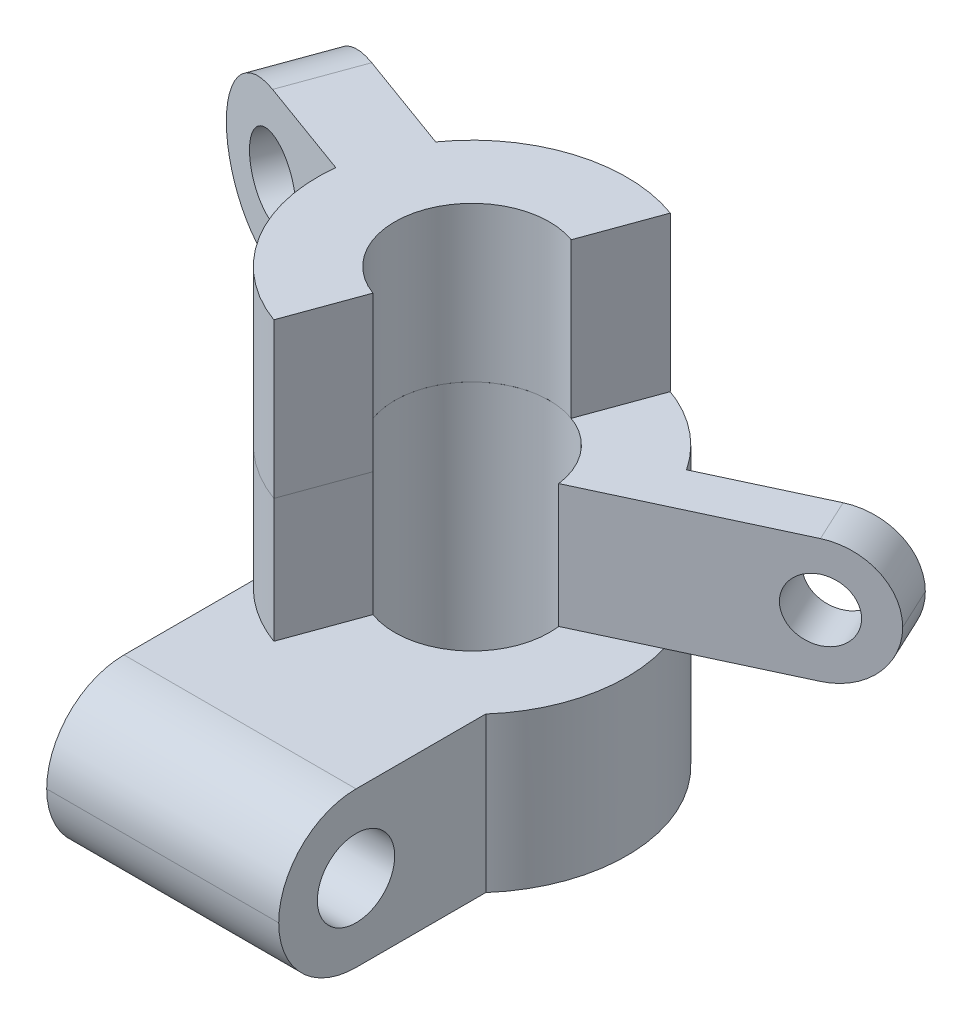
ISO-10303-21;
HEADER;
FILE_DESCRIPTION(('STEP AP214'),'2;1');
FILE_NAME('part.step','',(''),(''),'','','');
FILE_SCHEMA(('AUTOMOTIVE_DESIGN { 1 0 10303 214 1 1 1 1 }'));
ENDSEC;
DATA;
#1=APPLICATION_CONTEXT('core data for automotive mechanical design processes');
#2=APPLICATION_PROTOCOL_DEFINITION('international standard','automotive_design',2000,#1);
#3=PRODUCT_CONTEXT('',#1,'mechanical');
#4=PRODUCT('Part','Part','',(#3));
#5=PRODUCT_RELATED_PRODUCT_CATEGORY('part','',(#4));
#6=PRODUCT_DEFINITION_FORMATION('','',#4);
#7=PRODUCT_DEFINITION_CONTEXT('part definition',#1,'design');
#8=PRODUCT_DEFINITION('design','',#6,#7);
#9=PRODUCT_DEFINITION_SHAPE('','',#8);
#10=(LENGTH_UNIT() NAMED_UNIT(*) SI_UNIT(.MILLI.,.METRE.));
#11=(NAMED_UNIT(*) PLANE_ANGLE_UNIT() SI_UNIT($,.RADIAN.));
#12=(NAMED_UNIT(*) SI_UNIT($,.STERADIAN.) SOLID_ANGLE_UNIT());
#13=UNCERTAINTY_MEASURE_WITH_UNIT(LENGTH_MEASURE(1.E-05),#10,'distance_accuracy_value','');
#14=(GEOMETRIC_REPRESENTATION_CONTEXT(3) GLOBAL_UNCERTAINTY_ASSIGNED_CONTEXT((#13)) GLOBAL_UNIT_ASSIGNED_CONTEXT((#10,
#11,#12)) REPRESENTATION_CONTEXT('',''));
#15=CARTESIAN_POINT('',(0.,0.,0.));
#16=DIRECTION('',(0.,0.,1.));
#17=DIRECTION('',(1.,0.,0.));
#18=AXIS2_PLACEMENT_3D('',#15,#16,#17);
#19=CARTESIAN_POINT('',(15.,56.,-40.));
#20=DIRECTION('',(0.,-1.,0.));
#21=DIRECTION('',(0.,0.,-1.));
#22=AXIS2_PLACEMENT_3D('',#19,#20,#21);
#23=CYLINDRICAL_SURFACE('',#22,10.);
#24=CARTESIAN_POINT('',(15.,36.,-40.));
#25=DIRECTION('',(0.,1.,0.));
#26=DIRECTION('',(0.,0.,1.));
#27=AXIS2_PLACEMENT_3D('',#24,#25,#26);
#28=CIRCLE('',#27,10.);
#29=CARTESIAN_POINT('',(11.5797985667433,36.,-30.6030737921409));
#30=VERTEX_POINT('',#29);
#31=CARTESIAN_POINT('',(18.4202014332567,36.,-49.3969262078591));
#32=VERTEX_POINT('',#31);
#33=EDGE_CURVE('E149',#30,#32,#28,.F.);
#34=ORIENTED_EDGE('',*,*,#33,.T.);
#35=DIRECTION('',(0.,-1.,0.));
#36=VECTOR('',#35,1.);
#37=CARTESIAN_POINT('',(18.4202014332567,56.,-49.3969262078591));
#38=LINE('',#37,#36);
#39=CARTESIAN_POINT('',(18.4202014332567,56.,-49.3969262078591));
#40=VERTEX_POINT('',#39);
#41=EDGE_CURVE('E130',#40,#32,#38,.T.);
#42=ORIENTED_EDGE('',*,*,#41,.F.);
#43=CARTESIAN_POINT('',(15.,56.,-40.));
#44=DIRECTION('',(0.,1.,0.));
#45=DIRECTION('',(0.,0.,1.));
#46=AXIS2_PLACEMENT_3D('',#43,#44,#45);
#47=CIRCLE('',#46,10.);
#48=CARTESIAN_POINT('',(11.5797985667433,56.,-30.6030737921409));
#49=VERTEX_POINT('',#48);
#50=EDGE_CURVE('E137',#49,#40,#47,.F.);
#51=ORIENTED_EDGE('',*,*,#50,.F.);
#52=DIRECTION('',(0.,-1.,0.));
#53=VECTOR('',#52,1.);
#54=CARTESIAN_POINT('',(11.5797985667433,56.,-30.6030737921409));
#55=LINE('',#54,#53);
#56=EDGE_CURVE('E204',#49,#30,#55,.T.);
#57=ORIENTED_EDGE('',*,*,#56,.T.);
#58=EDGE_LOOP('',(#34,#42,#51,#57));
#59=FACE_BOUND('',#58,.T.);
#60=ADVANCED_FACE('F55',(#59),#23,.F.);
#61=CARTESIAN_POINT('',(0.389581129661505,56.,0.14179593502859));
#62=DIRECTION('',(-0.939692620785908,0.,-0.34202014332567));
#63=DIRECTION('',(-0.34202014332567,0.,0.939692620785908));
#64=AXIS2_PLACEMENT_3D('',#61,#62,#63);
#65=PLANE('',#64);
#66=DIRECTION('',(0.34202014332567,0.,-0.939692620785908));
#67=VECTOR('',#66,1.);
#68=CARTESIAN_POINT('',(0.389581129661505,36.,0.14179593502859));
#69=LINE('',#68,#67);
#70=CARTESIAN_POINT('',(21.8404028665134,36.,-58.7938524157182));
#71=VERTEX_POINT('',#70);
#72=EDGE_CURVE('E187',#32,#71,#69,.T.);
#73=ORIENTED_EDGE('',*,*,#72,.T.);
#74=DIRECTION('',(0.,-1.,0.));
#75=VECTOR('',#74,1.);
#76=CARTESIAN_POINT('',(21.8404028665134,56.,-58.7938524157182));
#77=LINE('',#76,#75);
#78=CARTESIAN_POINT('',(21.8404028665134,56.,-58.7938524157182));
#79=VERTEX_POINT('',#78);
#80=EDGE_CURVE('E133',#79,#71,#77,.T.);
#81=ORIENTED_EDGE('',*,*,#80,.F.);
#82=DIRECTION('',(0.34202014332567,0.,-0.939692620785908));
#83=VECTOR('',#82,1.);
#84=CARTESIAN_POINT('',(0.389581129661505,56.,0.14179593502859));
#85=LINE('',#84,#83);
#86=EDGE_CURVE('E126',#40,#79,#85,.T.);
#87=ORIENTED_EDGE('',*,*,#86,.F.);
#88=ORIENTED_EDGE('',*,*,#41,.T.);
#89=EDGE_LOOP('',(#73,#81,#87,#88));
#90=FACE_BOUND('',#89,.T.);
#91=ADVANCED_FACE('F128',(#90),#65,.F.);
#92=CARTESIAN_POINT('',(15.,56.,-40.));
#93=DIRECTION('',(0.,-1.,0.));
#94=DIRECTION('',(0.,0.,-1.));
#95=AXIS2_PLACEMENT_3D('',#92,#93,#94);
#96=CYLINDRICAL_SURFACE('',#95,20.);
#97=CARTESIAN_POINT('',(15.,36.,-40.));
#98=DIRECTION('',(0.,1.,0.));
#99=DIRECTION('',(0.,0.,1.));
#100=AXIS2_PLACEMENT_3D('',#97,#98,#99);
#101=CIRCLE('',#100,20.);
#102=CARTESIAN_POINT('',(-1.297071504847,36.,-51.5933368952129));
#103=VERTEX_POINT('',#102);
#104=EDGE_CURVE('E207',#71,#103,#101,.T.);
#105=ORIENTED_EDGE('',*,*,#104,.T.);
#106=DIRECTION('',(0.,-1.,0.));
#107=VECTOR('',#106,1.);
#108=CARTESIAN_POINT('',(-1.297071504847,56.,-51.5933368952129));
#109=LINE('',#108,#107);
#110=CARTESIAN_POINT('',(-1.297071504847,56.,-51.5933368952129));
#111=VERTEX_POINT('',#110);
#112=EDGE_CURVE('E155',#111,#103,#109,.T.);
#113=ORIENTED_EDGE('',*,*,#112,.F.);
#114=CARTESIAN_POINT('',(15.,56.,-40.));
#115=DIRECTION('',(0.,1.,0.));
#116=DIRECTION('',(0.,0.,1.));
#117=AXIS2_PLACEMENT_3D('',#114,#115,#116);
#118=CIRCLE('',#117,20.);
#119=EDGE_CURVE('E136',#79,#111,#118,.T.);
#120=ORIENTED_EDGE('',*,*,#119,.F.);
#121=ORIENTED_EDGE('',*,*,#80,.T.);
#122=EDGE_LOOP('',(#105,#113,#120,#121));
#123=FACE_BOUND('',#122,.T.);
#124=ADVANCED_FACE('F221',(#123),#96,.T.);
#125=CARTESIAN_POINT('',(16.4300503061976,56.,-45.1411922167814));
#126=DIRECTION('',(0.342020143325669,0.,-0.939692620785908));
#127=DIRECTION('',(-0.939692620785908,0.,-0.342020143325669));
#128=AXIS2_PLACEMENT_3D('',#125,#126,#127);
#129=PLANE('',#128);
#130=CARTESIAN_POINT('',(-14.2997557693066,46.,-56.3259269330377));
#131=DIRECTION('',(0.342020143325669,0.,-0.939692620785908));
#132=DIRECTION('',(-0.939692620785908,0.,-0.342020143325669));
#133=AXIS2_PLACEMENT_3D('',#130,#131,#132);
#134=CIRCLE('',#133,5.);
#135=CARTESIAN_POINT('',(-18.9982188732362,46.,-58.0360276496661));
#136=VERTEX_POINT('',#135);
#137=EDGE_CURVE('E186',#136,#136,#134,.T.);
#138=ORIENTED_EDGE('',*,*,#137,.F.);
#139=EDGE_LOOP('',(#138));
#140=FACE_BOUND('',#139,.T.);
#141=DIRECTION('',(0.939692620785908,0.,0.342020143325669));
#142=VECTOR('',#141,1.);
#143=CARTESIAN_POINT('',(16.4300503061976,36.,-45.1411922167814));
#144=LINE('',#143,#142);
#145=CARTESIAN_POINT('',(-14.2997557693066,36.,-56.3259269330377));
#146=VERTEX_POINT('',#145);
#147=EDGE_CURVE('E178',#146,#103,#144,.T.);
#148=ORIENTED_EDGE('',*,*,#147,.F.);
#149=CARTESIAN_POINT('',(-14.2997557693066,46.,-56.3259269330377));
#150=DIRECTION('',(0.342020143325669,0.,-0.939692620785908));
#151=DIRECTION('',(-0.939692620785908,0.,-0.342020143325669));
#152=AXIS2_PLACEMENT_3D('',#149,#150,#151);
#153=CIRCLE('',#152,10.);
#154=CARTESIAN_POINT('',(-23.6966819771657,46.,-59.7461283662944));
#155=VERTEX_POINT('',#154);
#156=EDGE_CURVE('E160',#146,#155,#153,.T.);
#157=ORIENTED_EDGE('',*,*,#156,.T.);
#158=CARTESIAN_POINT('',(-14.2997557693066,46.,-56.3259269330377));
#159=DIRECTION('',(0.342020143325669,0.,-0.939692620785908));
#160=DIRECTION('',(-0.939692620785908,0.,-0.342020143325669));
#161=AXIS2_PLACEMENT_3D('',#158,#159,#160);
#162=CIRCLE('',#161,10.);
#163=CARTESIAN_POINT('',(-14.2997557693066,56.,-56.3259269330377));
#164=VERTEX_POINT('',#163);
#165=EDGE_CURVE('E153',#155,#164,#162,.T.);
#166=ORIENTED_EDGE('',*,*,#165,.T.);
#167=DIRECTION('',(0.939692620785908,0.,0.342020143325669));
#168=VECTOR('',#167,1.);
#169=CARTESIAN_POINT('',(16.4300503061976,56.,-45.1411922167814));
#170=LINE('',#169,#168);
#171=EDGE_CURVE('E198',#164,#111,#170,.T.);
#172=ORIENTED_EDGE('',*,*,#171,.T.);
#173=ORIENTED_EDGE('',*,*,#112,.T.);
#174=EDGE_LOOP('',(#148,#157,#166,#172,#173));
#175=FACE_BOUND('',#174,.T.);
#176=ADVANCED_FACE('F183',(#140,#175),#129,.T.);
#177=CARTESIAN_POINT('',(13.0098488729409,56.,-35.7442660089223));
#178=DIRECTION('',(0.342020143325669,0.,-0.939692620785908));
#179=DIRECTION('',(-0.939692620785908,0.,-0.342020143325669));
#180=AXIS2_PLACEMENT_3D('',#177,#178,#179);
#181=PLANE('',#180);
#182=CARTESIAN_POINT('',(-17.7199572025633,46.,-46.9290007251786));
#183=DIRECTION('',(-0.342020143325669,0.,0.939692620785908));
#184=DIRECTION('',(0.939692620785908,0.,0.342020143325669));
#185=AXIS2_PLACEMENT_3D('',#182,#183,#184);
#186=CIRCLE('',#185,5.);
#187=CARTESIAN_POINT('',(-13.0214940986338,46.,-45.2189000085503));
#188=VERTEX_POINT('',#187);
#189=EDGE_CURVE('E190',#188,#188,#186,.T.);
#190=ORIENTED_EDGE('',*,*,#189,.F.);
#191=EDGE_LOOP('',(#190));
#192=FACE_BOUND('',#191,.T.);
#193=CARTESIAN_POINT('',(-17.7199572025633,46.,-46.9290007251786));
#194=DIRECTION('',(0.342020143325669,0.,-0.939692620785908));
#195=DIRECTION('',(-0.939692620785908,0.,-0.342020143325669));
#196=AXIS2_PLACEMENT_3D('',#193,#194,#195);
#197=CIRCLE('',#196,10.);
#198=CARTESIAN_POINT('',(-17.7199572025633,56.,-46.9290007251786));
#199=VERTEX_POINT('',#198);
#200=CARTESIAN_POINT('',(-27.1168834104224,46.,-50.3492021584353));
#201=VERTEX_POINT('',#200);
#202=EDGE_CURVE('E71',#199,#201,#197,.F.);
#203=ORIENTED_EDGE('',*,*,#202,.T.);
#204=CARTESIAN_POINT('',(-17.7199572025633,46.,-46.9290007251786));
#205=DIRECTION('',(0.342020143325669,0.,-0.939692620785908));
#206=DIRECTION('',(-0.939692620785908,0.,-0.342020143325669));
#207=AXIS2_PLACEMENT_3D('',#204,#205,#206);
#208=CIRCLE('',#207,10.);
#209=CARTESIAN_POINT('',(-17.7199572025633,36.,-46.9290007251786));
#210=VERTEX_POINT('',#209);
#211=EDGE_CURVE('E64',#201,#210,#208,.F.);
#212=ORIENTED_EDGE('',*,*,#211,.T.);
#213=DIRECTION('',(0.939692620785908,0.,0.342020143325669));
#214=VECTOR('',#213,1.);
#215=CARTESIAN_POINT('',(13.0098488729409,36.,-35.7442660089223));
#216=LINE('',#215,#214);
#217=CARTESIAN_POINT('',(-4.87269683509203,36.,-42.2529803595512));
#218=VERTEX_POINT('',#217);
#219=EDGE_CURVE('E167',#210,#218,#216,.T.);
#220=ORIENTED_EDGE('',*,*,#219,.T.);
#221=DIRECTION('',(0.,-1.,0.));
#222=VECTOR('',#221,1.);
#223=CARTESIAN_POINT('',(-4.87269683509203,56.,-42.2529803595512));
#224=LINE('',#223,#222);
#225=CARTESIAN_POINT('',(-4.87269683509203,56.,-42.2529803595512));
#226=VERTEX_POINT('',#225);
#227=EDGE_CURVE('E217',#226,#218,#224,.T.);
#228=ORIENTED_EDGE('',*,*,#227,.F.);
#229=DIRECTION('',(0.939692620785908,0.,0.342020143325669));
#230=VECTOR('',#229,1.);
#231=CARTESIAN_POINT('',(13.0098488729409,56.,-35.7442660089223));
#232=LINE('',#231,#230);
#233=EDGE_CURVE('E200',#199,#226,#232,.T.);
#234=ORIENTED_EDGE('',*,*,#233,.F.);
#235=EDGE_LOOP('',(#203,#212,#220,#228,#234));
#236=FACE_BOUND('',#235,.T.);
#237=ADVANCED_FACE('F165',(#192,#236),#181,.F.);
#238=CARTESIAN_POINT('',(15.,56.,-40.));
#239=DIRECTION('',(0.,-1.,0.));
#240=DIRECTION('',(0.,0.,-1.));
#241=AXIS2_PLACEMENT_3D('',#238,#239,#240);
#242=CYLINDRICAL_SURFACE('',#241,20.);
#243=CARTESIAN_POINT('',(15.,36.,-40.));
#244=DIRECTION('',(0.,1.,0.));
#245=DIRECTION('',(0.,0.,1.));
#246=AXIS2_PLACEMENT_3D('',#243,#244,#245);
#247=CIRCLE('',#246,20.);
#248=CARTESIAN_POINT('',(8.15959713348661,36.,-21.2061475842818));
#249=VERTEX_POINT('',#248);
#250=EDGE_CURVE('E177',#218,#249,#247,.T.);
#251=ORIENTED_EDGE('',*,*,#250,.T.);
#252=DIRECTION('',(0.,-1.,0.));
#253=VECTOR('',#252,1.);
#254=CARTESIAN_POINT('',(8.15959713348661,56.,-21.2061475842818));
#255=LINE('',#254,#253);
#256=CARTESIAN_POINT('',(8.15959713348661,56.,-21.2061475842818));
#257=VERTEX_POINT('',#256);
#258=EDGE_CURVE('E214',#257,#249,#255,.T.);
#259=ORIENTED_EDGE('',*,*,#258,.F.);
#260=CARTESIAN_POINT('',(15.,56.,-40.));
#261=DIRECTION('',(0.,1.,0.));
#262=DIRECTION('',(0.,0.,1.));
#263=AXIS2_PLACEMENT_3D('',#260,#261,#262);
#264=CIRCLE('',#263,20.);
#265=EDGE_CURVE('E202',#226,#257,#264,.T.);
#266=ORIENTED_EDGE('',*,*,#265,.F.);
#267=ORIENTED_EDGE('',*,*,#227,.T.);
#268=EDGE_LOOP('',(#251,#259,#266,#267));
#269=FACE_BOUND('',#268,.T.);
#270=ADVANCED_FACE('F227',(#269),#242,.T.);
#271=CARTESIAN_POINT('',(0.38958112966151,56.,0.141795935028592));
#272=DIRECTION('',(-0.939692620785908,0.,-0.34202014332567));
#273=DIRECTION('',(-0.34202014332567,0.,0.939692620785908));
#274=AXIS2_PLACEMENT_3D('',#271,#272,#273);
#275=PLANE('',#274);
#276=DIRECTION('',(0.34202014332567,0.,-0.939692620785908));
#277=VECTOR('',#276,1.);
#278=CARTESIAN_POINT('',(0.38958112966151,36.,0.141795935028592));
#279=LINE('',#278,#277);
#280=EDGE_CURVE('E146',#249,#30,#279,.T.);
#281=ORIENTED_EDGE('',*,*,#280,.T.);
#282=ORIENTED_EDGE('',*,*,#56,.F.);
#283=DIRECTION('',(0.34202014332567,0.,-0.939692620785908));
#284=VECTOR('',#283,1.);
#285=CARTESIAN_POINT('',(0.38958112966151,56.,0.141795935028592));
#286=LINE('',#285,#284);
#287=EDGE_CURVE('E142',#257,#49,#286,.T.);
#288=ORIENTED_EDGE('',*,*,#287,.F.);
#289=ORIENTED_EDGE('',*,*,#258,.T.);
#290=EDGE_LOOP('',(#281,#282,#288,#289));
#291=FACE_BOUND('',#290,.T.);
#292=ADVANCED_FACE('F223',(#291),#275,.F.);
#293=CARTESIAN_POINT('',(0.,56.,0.));
#294=DIRECTION('',(0.,1.,0.));
#295=DIRECTION('',(0.,0.,1.));
#296=AXIS2_PLACEMENT_3D('',#293,#294,#295);
#297=PLANE('',#296);
#298=ORIENTED_EDGE('',*,*,#171,.F.);
#299=DIRECTION('',(0.342020143325669,0.,-0.939692620785908));
#300=VECTOR('',#299,1.);
#301=CARTESIAN_POINT('',(-30.7298060755043,56.,-11.1847347162563));
#302=LINE('',#301,#300);
#303=EDGE_CURVE('E12',#164,#199,#302,.F.);
#304=ORIENTED_EDGE('',*,*,#303,.T.);
#305=ORIENTED_EDGE('',*,*,#233,.T.);
#306=ORIENTED_EDGE('',*,*,#265,.T.);
#307=ORIENTED_EDGE('',*,*,#287,.T.);
#308=ORIENTED_EDGE('',*,*,#50,.T.);
#309=ORIENTED_EDGE('',*,*,#86,.T.);
#310=ORIENTED_EDGE('',*,*,#119,.T.);
#311=EDGE_LOOP('',(#298,#304,#305,#306,#307,#308,#309,#310));
#312=FACE_BOUND('',#311,.T.);
#313=ADVANCED_FACE('F140',(#312),#297,.T.);
#314=CARTESIAN_POINT('',(0.,36.,0.));
#315=DIRECTION('',(0.,1.,0.));
#316=DIRECTION('',(0.,0.,1.));
#317=AXIS2_PLACEMENT_3D('',#314,#315,#316);
#318=PLANE('',#317);
#319=ORIENTED_EDGE('',*,*,#219,.F.);
#320=DIRECTION('',(0.342020143325669,0.,-0.939692620785908));
#321=VECTOR('',#320,1.);
#322=CARTESIAN_POINT('',(-14.2997557693066,36.,-56.3259269330377));
#323=LINE('',#322,#321);
#324=EDGE_CURVE('E150',#210,#146,#323,.T.);
#325=ORIENTED_EDGE('',*,*,#324,.T.);
#326=ORIENTED_EDGE('',*,*,#147,.T.);
#327=ORIENTED_EDGE('',*,*,#104,.F.);
#328=ORIENTED_EDGE('',*,*,#72,.F.);
#329=ORIENTED_EDGE('',*,*,#33,.F.);
#330=ORIENTED_EDGE('',*,*,#280,.F.);
#331=ORIENTED_EDGE('',*,*,#250,.F.);
#332=EDGE_LOOP('',(#319,#325,#326,#327,#328,#329,#330,#331));
#333=FACE_BOUND('',#332,.T.);
#334=ADVANCED_FACE('F174',(#333),#318,.F.);
#335=CARTESIAN_POINT('',(-30.7298060755043,46.,-11.1847347162563));
#336=DIRECTION('',(0.342020143325669,0.,-0.939692620785908));
#337=DIRECTION('',(-0.939692620785908,0.,-0.342020143325669));
#338=AXIS2_PLACEMENT_3D('',#335,#336,#337);
#339=CYLINDRICAL_SURFACE('',#338,10.);
#340=DIRECTION('',(0.342020143325669,0.,-0.939692620785908));
#341=VECTOR('',#340,1.);
#342=CARTESIAN_POINT('',(-40.1267322833634,46.,-14.604936149513));
#343=LINE('',#342,#341);
#344=EDGE_CURVE('E59',#201,#155,#343,.T.);
#345=ORIENTED_EDGE('',*,*,#344,.F.);
#346=ORIENTED_EDGE('',*,*,#202,.F.);
#347=ORIENTED_EDGE('',*,*,#303,.F.);
#348=ORIENTED_EDGE('',*,*,#165,.F.);
#349=EDGE_LOOP('',(#345,#346,#347,#348));
#350=FACE_BOUND('',#349,.T.);
#351=ADVANCED_FACE('F57',(#350),#339,.T.);
#352=CARTESIAN_POINT('',(-30.7298060755043,46.,-11.1847347162563));
#353=DIRECTION('',(-0.342020143325669,0.,0.939692620785908));
#354=DIRECTION('',(0.939692620785908,0.,0.342020143325669));
#355=AXIS2_PLACEMENT_3D('',#352,#353,#354);
#356=CYLINDRICAL_SURFACE('',#355,10.);
#357=ORIENTED_EDGE('',*,*,#211,.F.);
#358=ORIENTED_EDGE('',*,*,#344,.T.);
#359=ORIENTED_EDGE('',*,*,#156,.F.);
#360=ORIENTED_EDGE('',*,*,#324,.F.);
#361=EDGE_LOOP('',(#357,#358,#359,#360));
#362=FACE_BOUND('',#361,.T.);
#363=ADVANCED_FACE('F180',(#362),#356,.T.);
#364=CARTESIAN_POINT('',(-7.35195553949016,46.,-75.4148511793401));
#365=DIRECTION('',(-0.342020143325669,0.,0.939692620785908));
#366=DIRECTION('',(0.939692620785908,0.,0.342020143325669));
#367=AXIS2_PLACEMENT_3D('',#364,#365,#366);
#368=CYLINDRICAL_SURFACE('',#367,5.);
#369=ORIENTED_EDGE('',*,*,#137,.T.);
#370=EDGE_LOOP('',(#369));
#371=FACE_BOUND('',#370,.T.);
#372=ORIENTED_EDGE('',*,*,#189,.T.);
#373=EDGE_LOOP('',(#372));
#374=FACE_BOUND('',#373,.T.);
#375=ADVANCED_FACE('F246',(#371,#374),#368,.F.);
#376=CLOSED_SHELL('',(#60,#91,#124,#176,#237,#270,#292,#313,#334,#351,#363,#375));
#377=MANIFOLD_SOLID_BREP('B2',#376);
#378=CARTESIAN_POINT('',(0.,20.,0.));
#379=DIRECTION('',(0.,1.,0.));
#380=DIRECTION('',(0.,0.,1.));
#381=AXIS2_PLACEMENT_3D('',#378,#379,#380);
#382=PLANE('',#381);
#383=DIRECTION('',(0.342020143325671,0.,-0.939692620785908));
#384=VECTOR('',#383,1.);
#385=CARTESIAN_POINT('',(11.5797985667433,20.,-30.6030737921409));
#386=LINE('',#385,#384);
#387=CARTESIAN_POINT('',(8.15959713348659,20.,-21.2061475842818));
#388=VERTEX_POINT('',#387);
#389=CARTESIAN_POINT('',(11.5797985667433,20.,-30.6030737921409));
#390=VERTEX_POINT('',#389);
#391=EDGE_CURVE('E383',#388,#390,#386,.T.);
#392=ORIENTED_EDGE('',*,*,#391,.F.);
#393=CARTESIAN_POINT('',(15.,20.,-40.));
#394=DIRECTION('',(0.,1.,0.));
#395=DIRECTION('',(0.,0.,-1.));
#396=AXIS2_PLACEMENT_3D('',#393,#394,#395);
#397=CIRCLE('',#396,20.);
#398=CARTESIAN_POINT('',(0.,20.,-26.771243444677));
#399=VERTEX_POINT('',#398);
#400=EDGE_CURVE('E476',#399,#388,#397,.T.);
#401=ORIENTED_EDGE('',*,*,#400,.F.);
#402=DIRECTION('',(0.,0.,-1.));
#403=VECTOR('',#402,1.);
#404=CARTESIAN_POINT('',(0.,20.,0.));
#405=LINE('',#404,#403);
#406=CARTESIAN_POINT('',(0.,20.,-10.));
#407=VERTEX_POINT('',#406);
#408=EDGE_CURVE('E514',#407,#399,#405,.T.);
#409=ORIENTED_EDGE('',*,*,#408,.F.);
#410=DIRECTION('',(1.,0.,0.));
#411=VECTOR('',#410,1.);
#412=CARTESIAN_POINT('',(30.,20.,-10.));
#413=LINE('',#412,#411);
#414=CARTESIAN_POINT('',(30.,20.,-10.));
#415=VERTEX_POINT('',#414);
#416=EDGE_CURVE('E546',#407,#415,#413,.T.);
#417=ORIENTED_EDGE('',*,*,#416,.T.);
#418=DIRECTION('',(0.,0.,-1.));
#419=VECTOR('',#418,1.);
#420=CARTESIAN_POINT('',(30.,20.,0.));
#421=LINE('',#420,#419);
#422=CARTESIAN_POINT('',(30.,20.,-26.771243444677));
#423=VERTEX_POINT('',#422);
#424=EDGE_CURVE('E517',#415,#423,#421,.T.);
#425=ORIENTED_EDGE('',*,*,#424,.T.);
#426=CARTESIAN_POINT('',(15.,20.,-40.));
#427=DIRECTION('',(0.,1.,0.));
#428=DIRECTION('',(0.,0.,1.));
#429=AXIS2_PLACEMENT_3D('',#426,#427,#428);
#430=CIRCLE('',#429,20.);
#431=CARTESIAN_POINT('',(34.1949074502671,20.,-45.6174307272702));
#432=VERTEX_POINT('',#431);
#433=EDGE_CURVE('E511',#423,#432,#430,.T.);
#434=ORIENTED_EDGE('',*,*,#433,.T.);
#435=DIRECTION('',(0.906307787036649,0.,-0.422618261740701));
#436=VECTOR('',#435,1.);
#437=CARTESIAN_POINT('',(-11.3650673455664,20.,-24.3724655746242));
#438=LINE('',#437,#436);
#439=CARTESIAN_POINT('',(24.9163461871812,20.,-41.2907665536329));
#440=VERTEX_POINT('',#439);
#441=EDGE_CURVE('E548',#440,#432,#438,.T.);
#442=ORIENTED_EDGE('',*,*,#441,.F.);
#443=CARTESIAN_POINT('',(15.,20.,-40.));
#444=DIRECTION('',(0.,1.,0.));
#445=DIRECTION('',(0.,0.,1.));
#446=AXIS2_PLACEMENT_3D('',#443,#444,#445);
#447=CIRCLE('',#446,10.);
#448=EDGE_CURVE('E388',#390,#440,#447,.T.);
#449=ORIENTED_EDGE('',*,*,#448,.F.);
#450=EDGE_LOOP('',(#392,#401,#409,#417,#425,#434,#442,#449));
#451=FACE_BOUND('',#450,.T.);
#452=ADVANCED_FACE('F366',(#451),#382,.T.);
#453=CARTESIAN_POINT('',(15.,20.,-40.));
#454=DIRECTION('',(0.,-1.,0.));
#455=DIRECTION('',(0.,0.,-1.));
#456=AXIS2_PLACEMENT_3D('',#453,#454,#455);
#457=CYLINDRICAL_SURFACE('',#456,20.);
#458=DIRECTION('',(0.,-1.,0.));
#459=VECTOR('',#458,1.);
#460=CARTESIAN_POINT('',(0.,20.,-26.771243444677));
#461=LINE('',#460,#459);
#462=CARTESIAN_POINT('',(0.,0.,-26.771243444677));
#463=VERTEX_POINT('',#462);
#464=EDGE_CURVE('E532',#399,#463,#461,.T.);
#465=ORIENTED_EDGE('',*,*,#464,.F.);
#466=ORIENTED_EDGE('',*,*,#400,.T.);
#467=DIRECTION('',(0.,-1.,0.));
#468=VECTOR('',#467,1.);
#469=CARTESIAN_POINT('',(8.15959713348659,36.,-21.2061475842818));
#470=LINE('',#469,#468);
#471=CARTESIAN_POINT('',(8.15959713348659,36.,-21.2061475842818));
#472=VERTEX_POINT('',#471);
#473=EDGE_CURVE('E473',#472,#388,#470,.T.);
#474=ORIENTED_EDGE('',*,*,#473,.F.);
#475=CARTESIAN_POINT('',(15.,36.,-40.));
#476=DIRECTION('',(0.,1.,0.));
#477=DIRECTION('',(0.,0.,1.));
#478=AXIS2_PLACEMENT_3D('',#475,#476,#477);
#479=CIRCLE('',#478,20.);
#480=CARTESIAN_POINT('',(31.6414502713427,36.,-51.0933373186985));
#481=VERTEX_POINT('',#480);
#482=EDGE_CURVE('E457',#481,#472,#479,.T.);
#483=ORIENTED_EDGE('',*,*,#482,.F.);
#484=DIRECTION('',(0.,-1.,0.));
#485=VECTOR('',#484,1.);
#486=CARTESIAN_POINT('',(31.6414502713427,36.,-51.0933373186985));
#487=LINE('',#486,#485);
#488=CARTESIAN_POINT('',(31.6414502713427,20.,-51.0933373186985));
#489=VERTEX_POINT('',#488);
#490=EDGE_CURVE('E502',#481,#489,#487,.T.);
#491=ORIENTED_EDGE('',*,*,#490,.T.);
#492=EDGE_CURVE('E509',#432,#489,#430,.T.);
#493=ORIENTED_EDGE('',*,*,#492,.F.);
#494=ORIENTED_EDGE('',*,*,#433,.F.);
#495=DIRECTION('',(0.,-1.,0.));
#496=VECTOR('',#495,1.);
#497=CARTESIAN_POINT('',(30.,20.,-26.771243444677));
#498=LINE('',#497,#496);
#499=CARTESIAN_POINT('',(30.,0.,-26.771243444677));
#500=VERTEX_POINT('',#499);
#501=EDGE_CURVE('E519',#423,#500,#498,.T.);
#502=ORIENTED_EDGE('',*,*,#501,.T.);
#503=CARTESIAN_POINT('',(15.,0.,-40.));
#504=DIRECTION('',(0.,1.,0.));
#505=DIRECTION('',(0.,0.,1.));
#506=AXIS2_PLACEMENT_3D('',#503,#504,#505);
#507=CIRCLE('',#506,20.);
#508=EDGE_CURVE('E523',#500,#463,#507,.T.);
#509=ORIENTED_EDGE('',*,*,#508,.T.);
#510=EDGE_LOOP('',(#465,#466,#474,#483,#491,#493,#494,#502,#509));
#511=FACE_BOUND('',#510,.T.);
#512=ADVANCED_FACE('F475',(#511),#457,.T.);
#513=CARTESIAN_POINT('',(0.,20.,0.));
#514=DIRECTION('',(-1.,0.,0.));
#515=DIRECTION('',(0.,0.,1.));
#516=AXIS2_PLACEMENT_3D('',#513,#514,#515);
#517=PLANE('',#516);
#518=CARTESIAN_POINT('',(0.,10.,-10.));
#519=DIRECTION('',(-1.,0.,0.));
#520=DIRECTION('',(0.,0.,1.));
#521=AXIS2_PLACEMENT_3D('',#518,#519,#520);
#522=CIRCLE('',#521,5.);
#523=CARTESIAN_POINT('',(0.,10.,-5.));
#524=VERTEX_POINT('',#523);
#525=EDGE_CURVE('E504',#524,#524,#522,.T.);
#526=ORIENTED_EDGE('',*,*,#525,.F.);
#527=EDGE_LOOP('',(#526));
#528=FACE_BOUND('',#527,.T.);
#529=DIRECTION('',(0.,0.,-1.));
#530=VECTOR('',#529,1.);
#531=CARTESIAN_POINT('',(0.,0.,0.));
#532=LINE('',#531,#530);
#533=CARTESIAN_POINT('',(0.,0.,-10.));
#534=VERTEX_POINT('',#533);
#535=EDGE_CURVE('E527',#534,#463,#532,.T.);
#536=ORIENTED_EDGE('',*,*,#535,.F.);
#537=CARTESIAN_POINT('',(0.,10.,-10.));
#538=DIRECTION('',(-1.,0.,0.));
#539=DIRECTION('',(0.,0.,1.));
#540=AXIS2_PLACEMENT_3D('',#537,#538,#539);
#541=CIRCLE('',#540,10.);
#542=CARTESIAN_POINT('',(0.,10.,0.));
#543=VERTEX_POINT('',#542);
#544=EDGE_CURVE('E544',#534,#543,#541,.T.);
#545=ORIENTED_EDGE('',*,*,#544,.T.);
#546=CARTESIAN_POINT('',(0.,10.,-10.));
#547=DIRECTION('',(-1.,0.,0.));
#548=DIRECTION('',(0.,0.,1.));
#549=AXIS2_PLACEMENT_3D('',#546,#547,#548);
#550=CIRCLE('',#549,10.);
#551=EDGE_CURVE('E542',#543,#407,#550,.T.);
#552=ORIENTED_EDGE('',*,*,#551,.T.);
#553=ORIENTED_EDGE('',*,*,#408,.T.);
#554=ORIENTED_EDGE('',*,*,#464,.T.);
#555=EDGE_LOOP('',(#536,#545,#552,#553,#554));
#556=FACE_BOUND('',#555,.T.);
#557=ADVANCED_FACE('F607',(#528,#556),#517,.T.);
#558=CARTESIAN_POINT('',(15.,20.,-40.));
#559=DIRECTION('',(0.,-1.,0.));
#560=DIRECTION('',(0.,0.,-1.));
#561=AXIS2_PLACEMENT_3D('',#558,#559,#560);
#562=CYLINDRICAL_SURFACE('',#561,10.);
#563=DIRECTION('',(0.,-1.,0.));
#564=VECTOR('',#563,1.);
#565=CARTESIAN_POINT('',(11.5797985667433,36.,-30.6030737921409));
#566=LINE('',#565,#564);
#567=CARTESIAN_POINT('',(11.5797985667433,36.,-30.6030737921409));
#568=VERTEX_POINT('',#567);
#569=EDGE_CURVE('E479',#568,#390,#566,.T.);
#570=ORIENTED_EDGE('',*,*,#569,.T.);
#571=ORIENTED_EDGE('',*,*,#448,.T.);
#572=DIRECTION('',(0.,-1.,0.));
#573=VECTOR('',#572,1.);
#574=CARTESIAN_POINT('',(24.9163461871812,36.,-41.2907665536329));
#575=LINE('',#574,#573);
#576=CARTESIAN_POINT('',(24.9163461871812,36.,-41.2907665536329));
#577=VERTEX_POINT('',#576);
#578=EDGE_CURVE('E495',#577,#440,#575,.T.);
#579=ORIENTED_EDGE('',*,*,#578,.F.);
#580=CARTESIAN_POINT('',(15.,36.,-40.));
#581=DIRECTION('',(0.,1.,0.));
#582=DIRECTION('',(0.,0.,1.));
#583=AXIS2_PLACEMENT_3D('',#580,#581,#582);
#584=CIRCLE('',#583,10.);
#585=EDGE_CURVE('E470',#568,#577,#584,.F.);
#586=ORIENTED_EDGE('',*,*,#585,.F.);
#587=EDGE_LOOP('',(#570,#571,#579,#586));
#588=FACE_BOUND('',#587,.T.);
#589=CARTESIAN_POINT('',(15.,0.,-40.));
#590=DIRECTION('',(0.,1.,0.));
#591=DIRECTION('',(0.,0.,1.));
#592=AXIS2_PLACEMENT_3D('',#589,#590,#591);
#593=CIRCLE('',#592,10.);
#594=CARTESIAN_POINT('',(15.,0.,-30.));
#595=VERTEX_POINT('',#594);
#596=EDGE_CURVE('E520',#595,#595,#593,.T.);
#597=ORIENTED_EDGE('',*,*,#596,.F.);
#598=EDGE_LOOP('',(#597));
#599=FACE_BOUND('',#598,.T.);
#600=ADVANCED_FACE('F621',(#588,#599),#562,.F.);
#601=CARTESIAN_POINT('',(30.,20.,0.));
#602=DIRECTION('',(-1.,0.,0.));
#603=DIRECTION('',(0.,0.,1.));
#604=AXIS2_PLACEMENT_3D('',#601,#602,#603);
#605=PLANE('',#604);
#606=CARTESIAN_POINT('',(30.,10.,-10.));
#607=DIRECTION('',(-1.,0.,0.));
#608=DIRECTION('',(0.,0.,1.));
#609=AXIS2_PLACEMENT_3D('',#606,#607,#608);
#610=CIRCLE('',#609,5.);
#611=CARTESIAN_POINT('',(30.,10.,-5.));
#612=VERTEX_POINT('',#611);
#613=EDGE_CURVE('E507',#612,#612,#610,.T.);
#614=ORIENTED_EDGE('',*,*,#613,.T.);
#615=EDGE_LOOP('',(#614));
#616=FACE_BOUND('',#615,.T.);
#617=CARTESIAN_POINT('',(30.,10.,-10.));
#618=DIRECTION('',(-1.,0.,0.));
#619=DIRECTION('',(0.,0.,1.));
#620=AXIS2_PLACEMENT_3D('',#617,#618,#619);
#621=CIRCLE('',#620,10.);
#622=CARTESIAN_POINT('',(30.,10.,0.));
#623=VERTEX_POINT('',#622);
#624=EDGE_CURVE('E535',#415,#623,#621,.F.);
#625=ORIENTED_EDGE('',*,*,#624,.T.);
#626=CARTESIAN_POINT('',(30.,10.,-10.));
#627=DIRECTION('',(-1.,0.,0.));
#628=DIRECTION('',(0.,0.,1.));
#629=AXIS2_PLACEMENT_3D('',#626,#627,#628);
#630=CIRCLE('',#629,10.);
#631=CARTESIAN_POINT('',(30.,0.,-10.));
#632=VERTEX_POINT('',#631);
#633=EDGE_CURVE('E537',#623,#632,#630,.F.);
#634=ORIENTED_EDGE('',*,*,#633,.T.);
#635=DIRECTION('',(0.,0.,-1.));
#636=VECTOR('',#635,1.);
#637=CARTESIAN_POINT('',(30.,0.,0.));
#638=LINE('',#637,#636);
#639=EDGE_CURVE('E510',#632,#500,#638,.T.);
#640=ORIENTED_EDGE('',*,*,#639,.T.);
#641=ORIENTED_EDGE('',*,*,#501,.F.);
#642=ORIENTED_EDGE('',*,*,#424,.F.);
#643=EDGE_LOOP('',(#625,#634,#640,#641,#642));
#644=FACE_BOUND('',#643,.T.);
#645=ADVANCED_FACE('F617',(#616,#644),#605,.F.);
#646=CARTESIAN_POINT('',(0.,0.,0.));
#647=DIRECTION('',(0.,1.,0.));
#648=DIRECTION('',(0.,0.,1.));
#649=AXIS2_PLACEMENT_3D('',#646,#647,#648);
#650=PLANE('',#649);
#651=ORIENTED_EDGE('',*,*,#596,.T.);
#652=EDGE_LOOP('',(#651));
#653=FACE_BOUND('',#652,.T.);
#654=ORIENTED_EDGE('',*,*,#639,.F.);
#655=DIRECTION('',(1.,0.,0.));
#656=VECTOR('',#655,1.);
#657=CARTESIAN_POINT('',(0.,0.,-10.));
#658=LINE('',#657,#656);
#659=EDGE_CURVE('E539',#632,#534,#658,.F.);
#660=ORIENTED_EDGE('',*,*,#659,.T.);
#661=ORIENTED_EDGE('',*,*,#535,.T.);
#662=ORIENTED_EDGE('',*,*,#508,.F.);
#663=EDGE_LOOP('',(#654,#660,#661,#662));
#664=FACE_BOUND('',#663,.T.);
#665=ADVANCED_FACE('F613',(#653,#664),#650,.F.);
#666=CARTESIAN_POINT('',(0.,10.,-10.));
#667=DIRECTION('',(-1.,0.,0.));
#668=DIRECTION('',(0.,0.,1.));
#669=AXIS2_PLACEMENT_3D('',#666,#667,#668);
#670=CYLINDRICAL_SURFACE('',#669,10.);
#671=ORIENTED_EDGE('',*,*,#416,.F.);
#672=ORIENTED_EDGE('',*,*,#551,.F.);
#673=DIRECTION('',(1.,0.,0.));
#674=VECTOR('',#673,1.);
#675=CARTESIAN_POINT('',(0.,10.,0.));
#676=LINE('',#675,#674);
#677=EDGE_CURVE('E524',#623,#543,#676,.F.);
#678=ORIENTED_EDGE('',*,*,#677,.F.);
#679=ORIENTED_EDGE('',*,*,#624,.F.);
#680=EDGE_LOOP('',(#671,#672,#678,#679));
#681=FACE_BOUND('',#680,.T.);
#682=ADVANCED_FACE('F616',(#681),#670,.T.);
#683=CARTESIAN_POINT('',(0.,10.,-10.));
#684=DIRECTION('',(1.,0.,0.));
#685=DIRECTION('',(0.,0.,-1.));
#686=AXIS2_PLACEMENT_3D('',#683,#684,#685);
#687=CYLINDRICAL_SURFACE('',#686,10.);
#688=ORIENTED_EDGE('',*,*,#544,.F.);
#689=ORIENTED_EDGE('',*,*,#659,.F.);
#690=ORIENTED_EDGE('',*,*,#633,.F.);
#691=ORIENTED_EDGE('',*,*,#677,.T.);
#692=EDGE_LOOP('',(#688,#689,#690,#691));
#693=FACE_BOUND('',#692,.T.);
#694=ADVANCED_FACE('F629',(#693),#687,.T.);
#695=CARTESIAN_POINT('',(35.,10.,-10.));
#696=DIRECTION('',(-1.,0.,0.));
#697=DIRECTION('',(0.,0.,1.));
#698=AXIS2_PLACEMENT_3D('',#695,#696,#697);
#699=CYLINDRICAL_SURFACE('',#698,5.);
#700=ORIENTED_EDGE('',*,*,#525,.T.);
#701=EDGE_LOOP('',(#700));
#702=FACE_BOUND('',#701,.T.);
#703=ORIENTED_EDGE('',*,*,#613,.F.);
#704=EDGE_LOOP('',(#703));
#705=FACE_BOUND('',#704,.T.);
#706=ADVANCED_FACE('F611',(#702,#705),#699,.F.);
#707=CARTESIAN_POINT('',(0.,20.,0.));
#708=DIRECTION('',(0.,1.,0.));
#709=DIRECTION('',(0.,0.,1.));
#710=AXIS2_PLACEMENT_3D('',#707,#708,#709);
#711=PLANE('',#710);
#712=DIRECTION('',(-0.90630778703665,0.,0.422618261740701));
#713=VECTOR('',#712,1.);
#714=CARTESIAN_POINT('',(-13.9185245244909,20.,-29.8483721660526));
#715=LINE('',#714,#713);
#716=CARTESIAN_POINT('',(45.4440439568205,20.,-57.5295924566387));
#717=VERTEX_POINT('',#716);
#718=EDGE_CURVE('E496',#717,#489,#715,.T.);
#719=ORIENTED_EDGE('',*,*,#718,.F.);
#720=DIRECTION('',(0.422618261740701,0.,0.906307787036649));
#721=VECTOR('',#720,1.);
#722=CARTESIAN_POINT('',(47.997501135745,20.,-52.0536858652104));
#723=LINE('',#722,#721);
#724=CARTESIAN_POINT('',(47.997501135745,20.,-52.0536858652104));
#725=VERTEX_POINT('',#724);
#726=EDGE_CURVE('E555',#717,#725,#723,.T.);
#727=ORIENTED_EDGE('',*,*,#726,.T.);
#728=DIRECTION('',(-0.906307787036649,0.,0.422618261740701));
#729=VECTOR('',#728,1.);
#730=CARTESIAN_POINT('',(-11.3650673455664,20.,-24.3724655746242));
#731=LINE('',#730,#729);
#732=EDGE_CURVE('E490',#725,#432,#731,.T.);
#733=ORIENTED_EDGE('',*,*,#732,.T.);
#734=ORIENTED_EDGE('',*,*,#492,.T.);
#735=EDGE_LOOP('',(#719,#727,#733,#734));
#736=FACE_BOUND('',#735,.T.);
#737=ADVANCED_FACE('F584',(#736),#711,.F.);
#738=CARTESIAN_POINT('',(-13.9185245244909,36.,-29.8483721660526));
#739=DIRECTION('',(0.422618261740701,0.,0.90630778703665));
#740=DIRECTION('',(0.90630778703665,0.,-0.422618261740701));
#741=AXIS2_PLACEMENT_3D('',#738,#739,#740);
#742=PLANE('',#741);
#743=CARTESIAN_POINT('',(45.4440439568205,28.,-57.5295924566387));
#744=DIRECTION('',(-0.422618261740701,0.,-0.906307787036649));
#745=DIRECTION('',(-0.906307787036649,0.,0.422618261740701));
#746=AXIS2_PLACEMENT_3D('',#743,#744,#745);
#747=CIRCLE('',#746,4.00000000000001);
#748=CARTESIAN_POINT('',(41.8188128086739,28.,-55.8391194096759));
#749=VERTEX_POINT('',#748);
#750=EDGE_CURVE('E478',#749,#749,#747,.T.);
#751=ORIENTED_EDGE('',*,*,#750,.F.);
#752=EDGE_LOOP('',(#751));
#753=FACE_BOUND('',#752,.T.);
#754=CARTESIAN_POINT('',(45.4440439568205,28.,-57.5295924566387));
#755=DIRECTION('',(0.422618261740701,0.,0.90630778703665));
#756=DIRECTION('',(0.90630778703665,0.,-0.422618261740701));
#757=AXIS2_PLACEMENT_3D('',#754,#755,#756);
#758=CIRCLE('',#757,8.);
#759=CARTESIAN_POINT('',(45.4440439568205,36.,-57.5295924566387));
#760=VERTEX_POINT('',#759);
#761=CARTESIAN_POINT('',(52.6945062531137,28.,-60.9105385505643));
#762=VERTEX_POINT('',#761);
#763=EDGE_CURVE('E562',#760,#762,#758,.F.);
#764=ORIENTED_EDGE('',*,*,#763,.T.);
#765=CARTESIAN_POINT('',(45.4440439568205,28.,-57.5295924566387));
#766=DIRECTION('',(0.422618261740701,0.,0.90630778703665));
#767=DIRECTION('',(0.90630778703665,0.,-0.422618261740701));
#768=AXIS2_PLACEMENT_3D('',#765,#766,#767);
#769=CIRCLE('',#768,8.);
#770=EDGE_CURVE('E375',#762,#717,#769,.F.);
#771=ORIENTED_EDGE('',*,*,#770,.T.);
#772=ORIENTED_EDGE('',*,*,#718,.T.);
#773=ORIENTED_EDGE('',*,*,#490,.F.);
#774=DIRECTION('',(-0.90630778703665,0.,0.422618261740701));
#775=VECTOR('',#774,1.);
#776=CARTESIAN_POINT('',(-13.9185245244909,36.,-29.8483721660526));
#777=LINE('',#776,#775);
#778=EDGE_CURVE('E466',#760,#481,#777,.T.);
#779=ORIENTED_EDGE('',*,*,#778,.F.);
#780=EDGE_LOOP('',(#764,#771,#772,#773,#779));
#781=FACE_BOUND('',#780,.T.);
#782=ADVANCED_FACE('F577',(#753,#781),#742,.F.);
#783=CARTESIAN_POINT('',(-11.3650673455664,36.,-24.3724655746242));
#784=DIRECTION('',(0.422618261740701,0.,0.906307787036649));
#785=DIRECTION('',(0.906307787036649,0.,-0.422618261740701));
#786=AXIS2_PLACEMENT_3D('',#783,#784,#785);
#787=PLANE('',#786);
#788=CARTESIAN_POINT('',(47.997501135745,28.,-52.0536858652104));
#789=DIRECTION('',(0.422618261740701,0.,0.906307787036649));
#790=DIRECTION('',(0.906307787036649,0.,-0.422618261740701));
#791=AXIS2_PLACEMENT_3D('',#788,#789,#790);
#792=CIRCLE('',#791,4.00000000000001);
#793=CARTESIAN_POINT('',(51.6227322838916,28.,-53.7441589121732));
#794=VERTEX_POINT('',#793);
#795=EDGE_CURVE('E370',#794,#794,#792,.T.);
#796=ORIENTED_EDGE('',*,*,#795,.F.);
#797=EDGE_LOOP('',(#796));
#798=FACE_BOUND('',#797,.T.);
#799=ORIENTED_EDGE('',*,*,#732,.F.);
#800=CARTESIAN_POINT('',(47.997501135745,28.,-52.0536858652104));
#801=DIRECTION('',(0.422618261740701,0.,0.906307787036649));
#802=DIRECTION('',(0.906307787036649,0.,-0.422618261740701));
#803=AXIS2_PLACEMENT_3D('',#800,#801,#802);
#804=CIRCLE('',#803,8.);
#805=CARTESIAN_POINT('',(55.2479634320382,28.,-55.434631959136));
#806=VERTEX_POINT('',#805);
#807=EDGE_CURVE('E560',#725,#806,#804,.T.);
#808=ORIENTED_EDGE('',*,*,#807,.T.);
#809=CARTESIAN_POINT('',(47.997501135745,28.,-52.0536858652104));
#810=DIRECTION('',(0.422618261740701,0.,0.906307787036649));
#811=DIRECTION('',(0.906307787036649,0.,-0.422618261740701));
#812=AXIS2_PLACEMENT_3D('',#809,#810,#811);
#813=CIRCLE('',#812,8.);
#814=CARTESIAN_POINT('',(47.997501135745,36.,-52.0536858652104));
#815=VERTEX_POINT('',#814);
#816=EDGE_CURVE('E558',#806,#815,#813,.T.);
#817=ORIENTED_EDGE('',*,*,#816,.T.);
#818=DIRECTION('',(-0.906307787036649,0.,0.422618261740701));
#819=VECTOR('',#818,1.);
#820=CARTESIAN_POINT('',(-11.3650673455664,36.,-24.3724655746242));
#821=LINE('',#820,#819);
#822=EDGE_CURVE('E493',#815,#577,#821,.T.);
#823=ORIENTED_EDGE('',*,*,#822,.T.);
#824=ORIENTED_EDGE('',*,*,#578,.T.);
#825=ORIENTED_EDGE('',*,*,#441,.T.);
#826=EDGE_LOOP('',(#799,#808,#817,#823,#824,#825));
#827=FACE_BOUND('',#826,.T.);
#828=ADVANCED_FACE('F574',(#798,#827),#787,.T.);
#829=CARTESIAN_POINT('',(0.,36.,0.));
#830=DIRECTION('',(0.,1.,0.));
#831=DIRECTION('',(0.,0.,1.));
#832=AXIS2_PLACEMENT_3D('',#829,#830,#831);
#833=PLANE('',#832);
#834=ORIENTED_EDGE('',*,*,#822,.F.);
#835=DIRECTION('',(0.422618261740701,0.,0.906307787036649));
#836=VECTOR('',#835,1.);
#837=CARTESIAN_POINT('',(59.3625684813114,36.,-27.6812202905861));
#838=LINE('',#837,#836);
#839=EDGE_CURVE('E53',#815,#760,#838,.F.);
#840=ORIENTED_EDGE('',*,*,#839,.T.);
#841=ORIENTED_EDGE('',*,*,#778,.T.);
#842=ORIENTED_EDGE('',*,*,#482,.T.);
#843=DIRECTION('',(0.342020143325671,0.,-0.939692620785908));
#844=VECTOR('',#843,1.);
#845=CARTESIAN_POINT('',(11.5797985667433,36.,-30.6030737921409));
#846=LINE('',#845,#844);
#847=EDGE_CURVE('E463',#472,#568,#846,.T.);
#848=ORIENTED_EDGE('',*,*,#847,.T.);
#849=ORIENTED_EDGE('',*,*,#585,.T.);
#850=EDGE_LOOP('',(#834,#840,#841,#842,#848,#849));
#851=FACE_BOUND('',#850,.T.);
#852=ADVANCED_FACE('F460',(#851),#833,.T.);
#853=CARTESIAN_POINT('',(59.3625684813114,28.,-27.6812202905861));
#854=DIRECTION('',(0.422618261740701,0.,0.906307787036649));
#855=DIRECTION('',(0.906307787036649,0.,-0.422618261740701));
#856=AXIS2_PLACEMENT_3D('',#853,#854,#855);
#857=CYLINDRICAL_SURFACE('',#856,8.);
#858=DIRECTION('',(0.422618261740701,0.,0.906307787036649));
#859=VECTOR('',#858,1.);
#860=CARTESIAN_POINT('',(66.6130307776045,28.,-31.0621663845118));
#861=LINE('',#860,#859);
#862=EDGE_CURVE('E498',#762,#806,#861,.T.);
#863=ORIENTED_EDGE('',*,*,#862,.F.);
#864=ORIENTED_EDGE('',*,*,#763,.F.);
#865=ORIENTED_EDGE('',*,*,#839,.F.);
#866=ORIENTED_EDGE('',*,*,#816,.F.);
#867=EDGE_LOOP('',(#863,#864,#865,#866));
#868=FACE_BOUND('',#867,.T.);
#869=ADVANCED_FACE('F368',(#868),#857,.T.);
#870=CARTESIAN_POINT('',(59.3625684813114,28.,-27.6812202905861));
#871=DIRECTION('',(-0.422618261740701,0.,-0.906307787036649));
#872=DIRECTION('',(-0.906307787036649,0.,0.422618261740701));
#873=AXIS2_PLACEMENT_3D('',#870,#871,#872);
#874=CYLINDRICAL_SURFACE('',#873,8.);
#875=ORIENTED_EDGE('',*,*,#770,.F.);
#876=ORIENTED_EDGE('',*,*,#862,.T.);
#877=ORIENTED_EDGE('',*,*,#807,.F.);
#878=ORIENTED_EDGE('',*,*,#726,.F.);
#879=EDGE_LOOP('',(#875,#876,#877,#878));
#880=FACE_BOUND('',#879,.T.);
#881=ADVANCED_FACE('F592',(#880),#874,.T.);
#882=CARTESIAN_POINT('',(69.2301970200659,28.,-6.5200226002094));
#883=DIRECTION('',(-0.422618261740701,0.,-0.906307787036649));
#884=DIRECTION('',(-0.90630778703665,0.,0.422618261740701));
#885=AXIS2_PLACEMENT_3D('',#882,#883,#884);
#886=CYLINDRICAL_SURFACE('',#885,4.00000000000001);
#887=ORIENTED_EDGE('',*,*,#795,.T.);
#888=EDGE_LOOP('',(#887));
#889=FACE_BOUND('',#888,.T.);
#890=ORIENTED_EDGE('',*,*,#750,.T.);
#891=EDGE_LOOP('',(#890));
#892=FACE_BOUND('',#891,.T.);
#893=ADVANCED_FACE('F571',(#889,#892),#886,.F.);
#894=CARTESIAN_POINT('',(11.5797985667433,36.,-30.6030737921409));
#895=DIRECTION('',(-0.939692620785908,0.,-0.342020143325671));
#896=DIRECTION('',(-0.342020143325671,0.,0.939692620785908));
#897=AXIS2_PLACEMENT_3D('',#894,#895,#896);
#898=PLANE('',#897);
#899=ORIENTED_EDGE('',*,*,#391,.T.);
#900=ORIENTED_EDGE('',*,*,#569,.F.);
#901=ORIENTED_EDGE('',*,*,#847,.F.);
#902=ORIENTED_EDGE('',*,*,#473,.T.);
#903=EDGE_LOOP('',(#899,#900,#901,#902));
#904=FACE_BOUND('',#903,.T.);
#905=ADVANCED_FACE('F481',(#904),#898,.F.);
#906=CLOSED_SHELL('',(#452,#512,#557,#600,#645,#665,#682,#694,#706,#737,#782,#828,#852,#869,
#881,#893,#905));
#907=MANIFOLD_SOLID_BREP('B6',#906);
#908=ADVANCED_BREP_SHAPE_REPRESENTATION('',(#18,#377,#907),#14);
#909=SHAPE_DEFINITION_REPRESENTATION(#9,#908);
ENDSEC;
END-ISO-10303-21;
